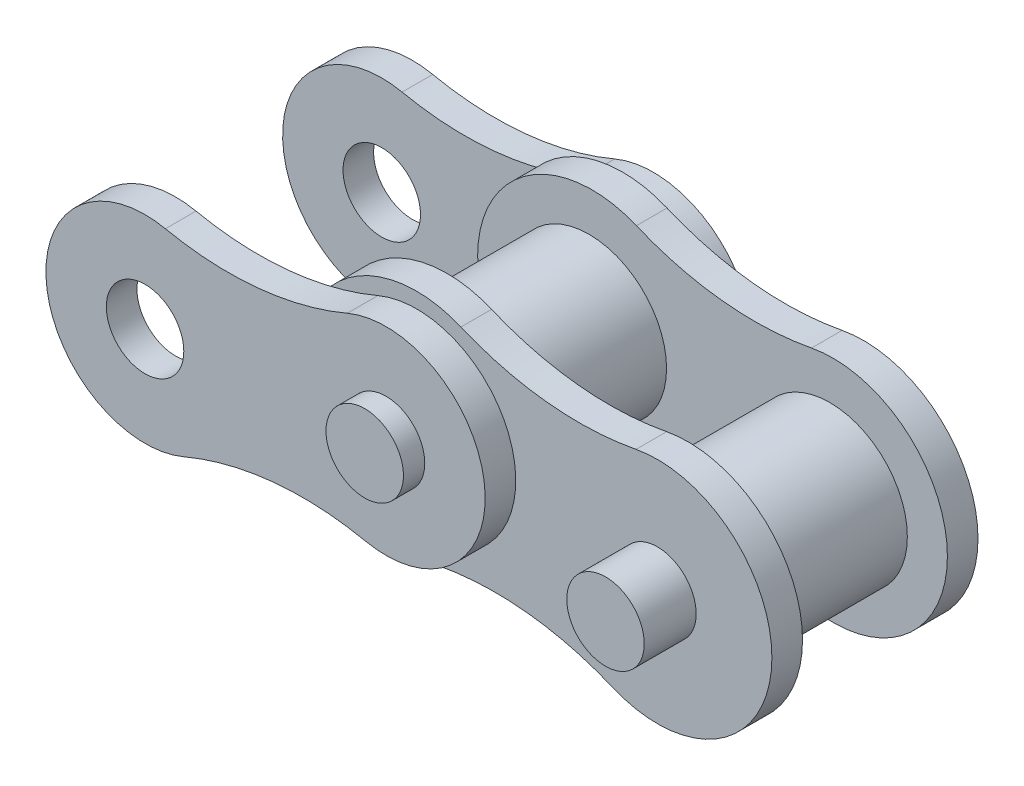
ISO-10303-21;
HEADER;
FILE_DESCRIPTION(('STEP AP214'),'2;1');
FILE_NAME('part.step','',(''),(''),'','','');
FILE_SCHEMA(('AUTOMOTIVE_DESIGN { 1 0 10303 214 1 1 1 1 }'));
ENDSEC;
DATA;
#1=APPLICATION_CONTEXT('core data for automotive mechanical design processes');
#2=APPLICATION_PROTOCOL_DEFINITION('international standard','automotive_design',2000,#1);
#3=PRODUCT_CONTEXT('',#1,'mechanical');
#4=PRODUCT('Part','Part','',(#3));
#5=PRODUCT_RELATED_PRODUCT_CATEGORY('part','',(#4));
#6=PRODUCT_DEFINITION_FORMATION('','',#4);
#7=PRODUCT_DEFINITION_CONTEXT('part definition',#1,'design');
#8=PRODUCT_DEFINITION('design','',#6,#7);
#9=PRODUCT_DEFINITION_SHAPE('','',#8);
#10=(LENGTH_UNIT() NAMED_UNIT(*) SI_UNIT(.MILLI.,.METRE.));
#11=(NAMED_UNIT(*) PLANE_ANGLE_UNIT() SI_UNIT($,.RADIAN.));
#12=(NAMED_UNIT(*) SI_UNIT($,.STERADIAN.) SOLID_ANGLE_UNIT());
#13=UNCERTAINTY_MEASURE_WITH_UNIT(LENGTH_MEASURE(1.E-05),#10,'distance_accuracy_value','');
#14=(GEOMETRIC_REPRESENTATION_CONTEXT(3) GLOBAL_UNCERTAINTY_ASSIGNED_CONTEXT((#13)) GLOBAL_UNIT_ASSIGNED_CONTEXT((#10,
#11,#12)) REPRESENTATION_CONTEXT('',''));
#15=CARTESIAN_POINT('',(0.,0.,0.));
#16=DIRECTION('',(0.,0.,1.));
#17=DIRECTION('',(1.,0.,0.));
#18=AXIS2_PLACEMENT_3D('',#15,#16,#17);
#19=CARTESIAN_POINT('',(15.7880356525904,74.277116008112,19.1184097937106));
#20=DIRECTION('',(0.,0.,-1.));
#21=DIRECTION('',(-1.,0.,0.));
#22=AXIS2_PLACEMENT_3D('',#19,#20,#21);
#23=CYLINDRICAL_SURFACE('',#22,5.08);
#24=CARTESIAN_POINT('',(15.7880356525904,74.277116008112,4.55));
#25=DIRECTION('',(0.,0.,-1.));
#26=DIRECTION('',(-1.,0.,0.));
#27=AXIS2_PLACEMENT_3D('',#24,#25,#26);
#28=CIRCLE('',#27,5.08);
#29=CARTESIAN_POINT('',(10.7080356525904,74.277116008112,4.55));
#30=VERTEX_POINT('',#29);
#31=EDGE_CURVE('E12',#30,#30,#28,.T.);
#32=ORIENTED_EDGE('',*,*,#31,.T.);
#33=EDGE_LOOP('',(#32));
#34=FACE_BOUND('',#33,.T.);
#35=CARTESIAN_POINT('',(15.7880356525904,74.277116008112,-4.55));
#36=DIRECTION('',(0.,0.,1.));
#37=DIRECTION('',(1.,0.,0.));
#38=AXIS2_PLACEMENT_3D('',#35,#36,#37);
#39=CIRCLE('',#38,5.08);
#40=CARTESIAN_POINT('',(20.8680356525904,74.277116008112,-4.55));
#41=VERTEX_POINT('',#40);
#42=EDGE_CURVE('E48',#41,#41,#39,.F.);
#43=ORIENTED_EDGE('',*,*,#42,.F.);
#44=EDGE_LOOP('',(#43));
#45=FACE_BOUND('',#44,.T.);
#46=ADVANCED_FACE('F42',(#34,#45),#23,.T.);
#47=CARTESIAN_POINT('',(5.32341019510183,88.6172802211531,4.55));
#48=DIRECTION('',(0.,0.,-1.));
#49=DIRECTION('',(-1.,0.,0.));
#50=AXIS2_PLACEMENT_3D('',#47,#48,#49);
#51=PLANE('',#50);
#52=ORIENTED_EDGE('',*,*,#31,.F.);
#53=EDGE_LOOP('',(#52));
#54=FACE_BOUND('',#53,.T.);
#55=ADVANCED_FACE('F57',(#54),#51,.F.);
#56=CARTESIAN_POINT('',(5.32341019510183,88.6172802211531,-4.55));
#57=DIRECTION('',(0.,0.,1.));
#58=DIRECTION('',(-1.,0.,0.));
#59=AXIS2_PLACEMENT_3D('',#56,#57,#58);
#60=PLANE('',#59);
#61=ORIENTED_EDGE('',*,*,#42,.T.);
#62=EDGE_LOOP('',(#61));
#63=FACE_BOUND('',#62,.T.);
#64=ADVANCED_FACE('F54',(#63),#60,.F.);
#65=CLOSED_SHELL('',(#46,#55,#64));
#66=MANIFOLD_SOLID_BREP('B2',#65);
#67=CARTESIAN_POINT('',(0.,75.9365,19.1184097937106));
#68=DIRECTION('',(0.,0.,-1.));
#69=DIRECTION('',(-1.,0.,0.));
#70=AXIS2_PLACEMENT_3D('',#67,#68,#69);
#71=CYLINDRICAL_SURFACE('',#70,5.08);
#72=CARTESIAN_POINT('',(0.,75.9365,4.55));
#73=DIRECTION('',(0.,0.,-1.));
#74=DIRECTION('',(-1.,0.,0.));
#75=AXIS2_PLACEMENT_3D('',#72,#73,#74);
#76=CIRCLE('',#75,5.08);
#77=CARTESIAN_POINT('',(-5.08,75.9365,4.55));
#78=VERTEX_POINT('',#77);
#79=EDGE_CURVE('E41',#78,#78,#76,.T.);
#80=ORIENTED_EDGE('',*,*,#79,.T.);
#81=EDGE_LOOP('',(#80));
#82=FACE_BOUND('',#81,.T.);
#83=CARTESIAN_POINT('',(0.,75.9365,-4.55));
#84=DIRECTION('',(0.,0.,1.));
#85=DIRECTION('',(1.,0.,0.));
#86=AXIS2_PLACEMENT_3D('',#83,#84,#85);
#87=CIRCLE('',#86,5.08);
#88=CARTESIAN_POINT('',(5.08,75.9365,-4.55));
#89=VERTEX_POINT('',#88);
#90=EDGE_CURVE('E97',#89,#89,#87,.F.);
#91=ORIENTED_EDGE('',*,*,#90,.F.);
#92=EDGE_LOOP('',(#91));
#93=FACE_BOUND('',#92,.T.);
#94=ADVANCED_FACE('F91',(#82,#93),#71,.T.);
#95=CARTESIAN_POINT('',(5.32341019510183,88.6172802211531,4.55));
#96=DIRECTION('',(0.,0.,-1.));
#97=DIRECTION('',(-1.,0.,0.));
#98=AXIS2_PLACEMENT_3D('',#95,#96,#97);
#99=PLANE('',#98);
#100=ORIENTED_EDGE('',*,*,#79,.F.);
#101=EDGE_LOOP('',(#100));
#102=FACE_BOUND('',#101,.T.);
#103=ADVANCED_FACE('F106',(#102),#99,.F.);
#104=CARTESIAN_POINT('',(5.32341019510183,88.6172802211531,-4.55));
#105=DIRECTION('',(0.,0.,1.));
#106=DIRECTION('',(-1.,0.,0.));
#107=AXIS2_PLACEMENT_3D('',#104,#105,#106);
#108=PLANE('',#107);
#109=ORIENTED_EDGE('',*,*,#90,.T.);
#110=EDGE_LOOP('',(#109));
#111=FACE_BOUND('',#110,.T.);
#112=ADVANCED_FACE('F103',(#111),#108,.F.);
#113=CLOSED_SHELL('',(#94,#103,#112));
#114=MANIFOLD_SOLID_BREP('B7',#113);
#115=CARTESIAN_POINT('',(15.7880356525904,74.277116008112,10.16));
#116=DIRECTION('',(0.,0.,-1.));
#117=DIRECTION('',(-1.,0.,0.));
#118=AXIS2_PLACEMENT_3D('',#115,#116,#117);
#119=CYLINDRICAL_SURFACE('',#118,2.54);
#120=CARTESIAN_POINT('',(15.7880356525904,74.277116008112,10.16));
#121=DIRECTION('',(0.,0.,-1.));
#122=DIRECTION('',(-1.,0.,0.));
#123=AXIS2_PLACEMENT_3D('',#120,#121,#122);
#124=CIRCLE('',#123,2.54);
#125=CARTESIAN_POINT('',(13.2480356525904,74.277116008112,10.16));
#126=VERTEX_POINT('',#125);
#127=EDGE_CURVE('E90',#126,#126,#124,.T.);
#128=ORIENTED_EDGE('',*,*,#127,.T.);
#129=EDGE_LOOP('',(#128));
#130=FACE_BOUND('',#129,.T.);
#131=CARTESIAN_POINT('',(15.7880356525904,74.277116008112,-10.16));
#132=DIRECTION('',(0.,0.,-1.));
#133=DIRECTION('',(-1.,0.,0.));
#134=AXIS2_PLACEMENT_3D('',#131,#132,#133);
#135=CIRCLE('',#134,2.54);
#136=CARTESIAN_POINT('',(13.2480356525904,74.277116008112,-10.16));
#137=VERTEX_POINT('',#136);
#138=EDGE_CURVE('E146',#137,#137,#135,.T.);
#139=ORIENTED_EDGE('',*,*,#138,.F.);
#140=EDGE_LOOP('',(#139));
#141=FACE_BOUND('',#140,.T.);
#142=ADVANCED_FACE('F140',(#130,#141),#119,.T.);
#143=CARTESIAN_POINT('',(15.7880356525904,74.277116008112,10.16));
#144=DIRECTION('',(0.,0.,-1.));
#145=DIRECTION('',(-1.,0.,0.));
#146=AXIS2_PLACEMENT_3D('',#143,#144,#145);
#147=PLANE('',#146);
#148=ORIENTED_EDGE('',*,*,#127,.F.);
#149=EDGE_LOOP('',(#148));
#150=FACE_BOUND('',#149,.T.);
#151=ADVANCED_FACE('F155',(#150),#147,.F.);
#152=CARTESIAN_POINT('',(15.7880356525904,74.277116008112,-10.16));
#153=DIRECTION('',(0.,0.,-1.));
#154=DIRECTION('',(-1.,0.,0.));
#155=AXIS2_PLACEMENT_3D('',#152,#153,#154);
#156=PLANE('',#155);
#157=ORIENTED_EDGE('',*,*,#138,.T.);
#158=EDGE_LOOP('',(#157));
#159=FACE_BOUND('',#158,.T.);
#160=ADVANCED_FACE('F152',(#159),#156,.T.);
#161=CLOSED_SHELL('',(#142,#151,#160));
#162=MANIFOLD_SOLID_BREP('B36',#161);
#163=CARTESIAN_POINT('',(0.,75.9365,10.16));
#164=DIRECTION('',(0.,0.,-1.));
#165=DIRECTION('',(-1.,0.,0.));
#166=AXIS2_PLACEMENT_3D('',#163,#164,#165);
#167=CYLINDRICAL_SURFACE('',#166,2.54);
#168=CARTESIAN_POINT('',(0.,75.9365,10.16));
#169=DIRECTION('',(0.,0.,-1.));
#170=DIRECTION('',(-1.,0.,0.));
#171=AXIS2_PLACEMENT_3D('',#168,#169,#170);
#172=CIRCLE('',#171,2.54);
#173=CARTESIAN_POINT('',(-2.54,75.9365,10.16));
#174=VERTEX_POINT('',#173);
#175=EDGE_CURVE('E139',#174,#174,#172,.T.);
#176=ORIENTED_EDGE('',*,*,#175,.T.);
#177=EDGE_LOOP('',(#176));
#178=FACE_BOUND('',#177,.T.);
#179=CARTESIAN_POINT('',(0.,75.9365,-10.16));
#180=DIRECTION('',(0.,0.,-1.));
#181=DIRECTION('',(-1.,0.,0.));
#182=AXIS2_PLACEMENT_3D('',#179,#180,#181);
#183=CIRCLE('',#182,2.54);
#184=CARTESIAN_POINT('',(-2.54,75.9365,-10.16));
#185=VERTEX_POINT('',#184);
#186=EDGE_CURVE('E197',#185,#185,#183,.T.);
#187=ORIENTED_EDGE('',*,*,#186,.F.);
#188=EDGE_LOOP('',(#187));
#189=FACE_BOUND('',#188,.T.);
#190=ADVANCED_FACE('F191',(#178,#189),#167,.T.);
#191=CARTESIAN_POINT('',(0.,75.9365,10.16));
#192=DIRECTION('',(0.,0.,-1.));
#193=DIRECTION('',(-1.,0.,0.));
#194=AXIS2_PLACEMENT_3D('',#191,#192,#193);
#195=PLANE('',#194);
#196=ORIENTED_EDGE('',*,*,#175,.F.);
#197=EDGE_LOOP('',(#196));
#198=FACE_BOUND('',#197,.T.);
#199=ADVANCED_FACE('F206',(#198),#195,.F.);
#200=CARTESIAN_POINT('',(0.,75.9365,-10.16));
#201=DIRECTION('',(0.,0.,-1.));
#202=DIRECTION('',(-1.,0.,0.));
#203=AXIS2_PLACEMENT_3D('',#200,#201,#202);
#204=PLANE('',#203);
#205=ORIENTED_EDGE('',*,*,#186,.T.);
#206=EDGE_LOOP('',(#205));
#207=FACE_BOUND('',#206,.T.);
#208=ADVANCED_FACE('F203',(#207),#204,.T.);
#209=CLOSED_SHELL('',(#190,#199,#208));
#210=MANIFOLD_SOLID_BREP('B85',#209);
#211=CARTESIAN_POINT('',(-13.0788342811586,87.3607901900289,-8.7632));
#212=DIRECTION('',(0.,0.,1.));
#213=DIRECTION('',(-1.,0.,0.));
#214=AXIS2_PLACEMENT_3D('',#211,#212,#213);
#215=PLANE('',#214);
#216=CARTESIAN_POINT('',(0.,75.9365,-8.7632));
#217=DIRECTION('',(0.,0.,1.));
#218=DIRECTION('',(1.,0.,0.));
#219=AXIS2_PLACEMENT_3D('',#216,#217,#218);
#220=CIRCLE('',#219,2.54);
#221=CARTESIAN_POINT('',(2.54,75.9365,-8.7632));
#222=VERTEX_POINT('',#221);
#223=EDGE_CURVE('E311',#222,#222,#220,.T.);
#224=ORIENTED_EDGE('',*,*,#223,.T.);
#225=EDGE_LOOP('',(#224));
#226=FACE_BOUND('',#225,.T.);
#227=CARTESIAN_POINT('',(-10.357864798803,100.328396949801,-8.7632));
#228=DIRECTION('',(0.,0.,-1.));
#229=DIRECTION('',(-1.,0.,0.));
#230=AXIS2_PLACEMENT_3D('',#227,#228,#229);
#231=CIRCLE('',#230,20.);
#232=CARTESIAN_POINT('',(-2.54060834687622,81.9194181197626,-8.7632));
#233=VERTEX_POINT('',#232);
#234=CARTESIAN_POINT('',(-14.4649885457548,80.7546508973148,-8.7632));
#235=VERTEX_POINT('',#234);
#236=EDGE_CURVE('E299',#233,#235,#231,.T.);
#237=ORIENTED_EDGE('',*,*,#236,.F.);
#238=CARTESIAN_POINT('',(0.,75.9365,-8.7632));
#239=DIRECTION('',(0.,0.,1.));
#240=DIRECTION('',(1.,0.,0.));
#241=AXIS2_PLACEMENT_3D('',#238,#239,#240);
#242=CIRCLE('',#241,6.5);
#243=CARTESIAN_POINT('',(-1.33481521775932,69.575032532942,-8.7632));
#244=VERTEX_POINT('',#243);
#245=EDGE_CURVE('E302',#244,#233,#242,.T.);
#246=ORIENTED_EDGE('',*,*,#245,.F.);
#247=CARTESIAN_POINT('',(-5.4419389647111,50.0012864804556,-8.7632));
#248=DIRECTION('',(0.,0.,-1.));
#249=DIRECTION('',(-1.,0.,0.));
#250=AXIS2_PLACEMENT_3D('',#247,#248,#249);
#251=CIRCLE('',#250,20.);
#252=CARTESIAN_POINT('',(-13.2591954166379,68.4102653104942,-8.7632));
#253=VERTEX_POINT('',#252);
#254=EDGE_CURVE('E290',#253,#244,#251,.T.);
#255=ORIENTED_EDGE('',*,*,#254,.F.);
#256=CARTESIAN_POINT('',(-15.7998037635141,74.3931834302567,-8.7632));
#257=DIRECTION('',(0.,0.,1.));
#258=DIRECTION('',(1.,0.,0.));
#259=AXIS2_PLACEMENT_3D('',#256,#257,#258);
#260=CIRCLE('',#259,6.5);
#261=EDGE_CURVE('E295',#235,#253,#260,.T.);
#262=ORIENTED_EDGE('',*,*,#261,.F.);
#263=EDGE_LOOP('',(#237,#246,#255,#262));
#264=FACE_BOUND('',#263,.T.);
#265=CARTESIAN_POINT('',(-15.7998037635141,74.3931834302567,-8.7632));
#266=DIRECTION('',(0.,0.,1.));
#267=DIRECTION('',(1.,0.,0.));
#268=AXIS2_PLACEMENT_3D('',#265,#266,#267);
#269=CIRCLE('',#268,2.53999999999999);
#270=CARTESIAN_POINT('',(-13.2598037635142,74.3931834302567,-8.7632));
#271=VERTEX_POINT('',#270);
#272=EDGE_CURVE('E322',#271,#271,#269,.T.);
#273=ORIENTED_EDGE('',*,*,#272,.T.);
#274=EDGE_LOOP('',(#273));
#275=FACE_BOUND('',#274,.T.);
#276=ADVANCED_FACE('F243',(#226,#264,#275),#215,.F.);
#277=CARTESIAN_POINT('',(-13.0788342811586,87.3607901900289,-6.7566));
#278=DIRECTION('',(0.,0.,1.));
#279=DIRECTION('',(-1.,0.,0.));
#280=AXIS2_PLACEMENT_3D('',#277,#278,#279);
#281=PLANE('',#280);
#282=CARTESIAN_POINT('',(0.,75.9365,-6.7566));
#283=DIRECTION('',(0.,0.,1.));
#284=DIRECTION('',(1.,0.,0.));
#285=AXIS2_PLACEMENT_3D('',#282,#283,#284);
#286=CIRCLE('',#285,2.54);
#287=CARTESIAN_POINT('',(2.54,75.9365,-6.7566));
#288=VERTEX_POINT('',#287);
#289=EDGE_CURVE('E319',#288,#288,#286,.T.);
#290=ORIENTED_EDGE('',*,*,#289,.F.);
#291=EDGE_LOOP('',(#290));
#292=FACE_BOUND('',#291,.T.);
#293=CARTESIAN_POINT('',(-10.357864798803,100.328396949801,-6.7566));
#294=DIRECTION('',(0.,0.,-1.));
#295=DIRECTION('',(-1.,0.,0.));
#296=AXIS2_PLACEMENT_3D('',#293,#294,#295);
#297=CIRCLE('',#296,20.);
#298=CARTESIAN_POINT('',(-2.54060834687622,81.9194181197626,-6.7566));
#299=VERTEX_POINT('',#298);
#300=CARTESIAN_POINT('',(-14.4649885457548,80.7546508973148,-6.7566));
#301=VERTEX_POINT('',#300);
#302=EDGE_CURVE('E307',#299,#301,#297,.T.);
#303=ORIENTED_EDGE('',*,*,#302,.T.);
#304=CARTESIAN_POINT('',(-15.7998037635141,74.3931834302567,-6.7566));
#305=DIRECTION('',(0.,0.,1.));
#306=DIRECTION('',(1.,0.,0.));
#307=AXIS2_PLACEMENT_3D('',#304,#305,#306);
#308=CIRCLE('',#307,6.5);
#309=CARTESIAN_POINT('',(-13.2591954166379,68.4102653104942,-6.7566));
#310=VERTEX_POINT('',#309);
#311=EDGE_CURVE('E310',#301,#310,#308,.T.);
#312=ORIENTED_EDGE('',*,*,#311,.T.);
#313=CARTESIAN_POINT('',(-5.4419389647111,50.0012864804556,-6.7566));
#314=DIRECTION('',(0.,0.,-1.));
#315=DIRECTION('',(-1.,0.,0.));
#316=AXIS2_PLACEMENT_3D('',#313,#314,#315);
#317=CIRCLE('',#316,20.);
#318=CARTESIAN_POINT('',(-1.33481521775932,69.575032532942,-6.7566));
#319=VERTEX_POINT('',#318);
#320=EDGE_CURVE('E293',#310,#319,#317,.T.);
#321=ORIENTED_EDGE('',*,*,#320,.T.);
#322=CARTESIAN_POINT('',(0.,75.9365,-6.7566));
#323=DIRECTION('',(0.,0.,1.));
#324=DIRECTION('',(1.,0.,0.));
#325=AXIS2_PLACEMENT_3D('',#322,#323,#324);
#326=CIRCLE('',#325,6.5);
#327=EDGE_CURVE('E314',#319,#299,#326,.T.);
#328=ORIENTED_EDGE('',*,*,#327,.T.);
#329=EDGE_LOOP('',(#303,#312,#321,#328));
#330=FACE_BOUND('',#329,.T.);
#331=CARTESIAN_POINT('',(-15.7998037635141,74.3931834302567,-6.7566));
#332=DIRECTION('',(0.,0.,1.));
#333=DIRECTION('',(1.,0.,0.));
#334=AXIS2_PLACEMENT_3D('',#331,#332,#333);
#335=CIRCLE('',#334,2.53999999999999);
#336=CARTESIAN_POINT('',(-13.2598037635142,74.3931834302567,-6.7566));
#337=VERTEX_POINT('',#336);
#338=EDGE_CURVE('E325',#337,#337,#335,.T.);
#339=ORIENTED_EDGE('',*,*,#338,.F.);
#340=EDGE_LOOP('',(#339));
#341=FACE_BOUND('',#340,.T.);
#342=ADVANCED_FACE('F338',(#292,#330,#341),#281,.T.);
#343=CARTESIAN_POINT('',(-10.357864798803,100.328396949801,-8.7632));
#344=DIRECTION('',(0.,0.,1.));
#345=DIRECTION('',(-1.,0.,0.));
#346=AXIS2_PLACEMENT_3D('',#343,#344,#345);
#347=CYLINDRICAL_SURFACE('',#346,20.);
#348=ORIENTED_EDGE('',*,*,#302,.F.);
#349=DIRECTION('',(0.,0.,1.));
#350=VECTOR('',#349,1.);
#351=CARTESIAN_POINT('',(-2.54060834687622,81.9194181197626,-8.7632));
#352=LINE('',#351,#350);
#353=EDGE_CURVE('E260',#233,#299,#352,.T.);
#354=ORIENTED_EDGE('',*,*,#353,.F.);
#355=ORIENTED_EDGE('',*,*,#236,.T.);
#356=DIRECTION('',(0.,0.,1.));
#357=VECTOR('',#356,1.);
#358=CARTESIAN_POINT('',(-14.4649885457548,80.7546508973148,-8.7632));
#359=LINE('',#358,#357);
#360=EDGE_CURVE('E189',#235,#301,#359,.T.);
#361=ORIENTED_EDGE('',*,*,#360,.T.);
#362=EDGE_LOOP('',(#348,#354,#355,#361));
#363=FACE_BOUND('',#362,.T.);
#364=ADVANCED_FACE('F245',(#363),#347,.F.);
#365=CARTESIAN_POINT('',(-15.7998037635141,74.3931834302567,-8.7632));
#366=DIRECTION('',(0.,0.,1.));
#367=DIRECTION('',(-1.,0.,0.));
#368=AXIS2_PLACEMENT_3D('',#365,#366,#367);
#369=CYLINDRICAL_SURFACE('',#368,6.5);
#370=ORIENTED_EDGE('',*,*,#311,.F.);
#371=ORIENTED_EDGE('',*,*,#360,.F.);
#372=ORIENTED_EDGE('',*,*,#261,.T.);
#373=DIRECTION('',(0.,0.,1.));
#374=VECTOR('',#373,1.);
#375=CARTESIAN_POINT('',(-13.2591954166379,68.4102653104942,-8.7632));
#376=LINE('',#375,#374);
#377=EDGE_CURVE('E252',#253,#310,#376,.T.);
#378=ORIENTED_EDGE('',*,*,#377,.T.);
#379=EDGE_LOOP('',(#370,#371,#372,#378));
#380=FACE_BOUND('',#379,.T.);
#381=ADVANCED_FACE('F296',(#380),#369,.T.);
#382=CARTESIAN_POINT('',(-5.4419389647111,50.0012864804556,-8.7632));
#383=DIRECTION('',(0.,0.,1.));
#384=DIRECTION('',(-1.,0.,0.));
#385=AXIS2_PLACEMENT_3D('',#382,#383,#384);
#386=CYLINDRICAL_SURFACE('',#385,20.);
#387=ORIENTED_EDGE('',*,*,#320,.F.);
#388=ORIENTED_EDGE('',*,*,#377,.F.);
#389=ORIENTED_EDGE('',*,*,#254,.T.);
#390=DIRECTION('',(0.,0.,1.));
#391=VECTOR('',#390,1.);
#392=CARTESIAN_POINT('',(-1.33481521775932,69.575032532942,-8.7632));
#393=LINE('',#392,#391);
#394=EDGE_CURVE('E276',#244,#319,#393,.T.);
#395=ORIENTED_EDGE('',*,*,#394,.T.);
#396=EDGE_LOOP('',(#387,#388,#389,#395));
#397=FACE_BOUND('',#396,.T.);
#398=ADVANCED_FACE('F288',(#397),#386,.F.);
#399=CARTESIAN_POINT('',(0.,75.9365,-8.7632));
#400=DIRECTION('',(0.,0.,1.));
#401=DIRECTION('',(-1.,0.,0.));
#402=AXIS2_PLACEMENT_3D('',#399,#400,#401);
#403=CYLINDRICAL_SURFACE('',#402,6.5);
#404=ORIENTED_EDGE('',*,*,#327,.F.);
#405=ORIENTED_EDGE('',*,*,#394,.F.);
#406=ORIENTED_EDGE('',*,*,#245,.T.);
#407=ORIENTED_EDGE('',*,*,#353,.T.);
#408=EDGE_LOOP('',(#404,#405,#406,#407));
#409=FACE_BOUND('',#408,.T.);
#410=ADVANCED_FACE('F351',(#409),#403,.T.);
#411=CARTESIAN_POINT('',(0.,75.9365,-8.7632));
#412=DIRECTION('',(0.,0.,1.));
#413=DIRECTION('',(-1.,0.,0.));
#414=AXIS2_PLACEMENT_3D('',#411,#412,#413);
#415=CYLINDRICAL_SURFACE('',#414,2.54);
#416=ORIENTED_EDGE('',*,*,#223,.F.);
#417=EDGE_LOOP('',(#416));
#418=FACE_BOUND('',#417,.T.);
#419=ORIENTED_EDGE('',*,*,#289,.T.);
#420=EDGE_LOOP('',(#419));
#421=FACE_BOUND('',#420,.T.);
#422=ADVANCED_FACE('F334',(#418,#421),#415,.F.);
#423=CARTESIAN_POINT('',(-15.7998037635141,74.3931834302567,-8.7632));
#424=DIRECTION('',(0.,0.,1.));
#425=DIRECTION('',(-1.,0.,0.));
#426=AXIS2_PLACEMENT_3D('',#423,#424,#425);
#427=CYLINDRICAL_SURFACE('',#426,2.53999999999999);
#428=ORIENTED_EDGE('',*,*,#272,.F.);
#429=EDGE_LOOP('',(#428));
#430=FACE_BOUND('',#429,.T.);
#431=ORIENTED_EDGE('',*,*,#338,.T.);
#432=EDGE_LOOP('',(#431));
#433=FACE_BOUND('',#432,.T.);
#434=ADVANCED_FACE('F331',(#430,#433),#427,.F.);
#435=CLOSED_SHELL('',(#276,#342,#364,#381,#398,#410,#422,#434));
#436=MANIFOLD_SOLID_BREP('B134',#435);
#437=CARTESIAN_POINT('',(5.32341019510183,88.6172802211531,-6.7566));
#438=DIRECTION('',(0.,0.,1.));
#439=DIRECTION('',(-1.,0.,0.));
#440=AXIS2_PLACEMENT_3D('',#437,#438,#439);
#441=PLANE('',#440);
#442=CARTESIAN_POINT('',(0.,75.9365,-6.7566));
#443=DIRECTION('',(0.,0.,1.));
#444=DIRECTION('',(1.,0.,0.));
#445=AXIS2_PLACEMENT_3D('',#442,#443,#444);
#446=CIRCLE('',#445,2.53999999999999);
#447=CARTESIAN_POINT('',(2.53999999999999,75.9365,-6.7566));
#448=VERTEX_POINT('',#447);
#449=EDGE_CURVE('E488',#448,#448,#446,.T.);
#450=ORIENTED_EDGE('',*,*,#449,.T.);
#451=EDGE_LOOP('',(#450));
#452=FACE_BOUND('',#451,.T.);
#453=CARTESIAN_POINT('',(10.6468203902037,101.298060442306,-6.7566));
#454=DIRECTION('',(0.,0.,-1.));
#455=DIRECTION('',(-1.,0.,0.));
#456=AXIS2_PLACEMENT_3D('',#453,#454,#455);
#457=CIRCLE('',#456,20.);
#458=CARTESIAN_POINT('',(14.3851111898465,81.6505368859566,-6.7566));
#459=VERTEX_POINT('',#458);
#460=CARTESIAN_POINT('',(2.90528289782669,82.8571115173152,-6.7566));
#461=VERTEX_POINT('',#460);
#462=EDGE_CURVE('E476',#459,#461,#457,.T.);
#463=ORIENTED_EDGE('',*,*,#462,.F.);
#464=CARTESIAN_POINT('',(15.7880356525904,74.277116008112,-6.7566));
#465=DIRECTION('',(0.,0.,1.));
#466=DIRECTION('',(1.,0.,0.));
#467=AXIS2_PLACEMENT_3D('',#464,#465,#466);
#468=CIRCLE('',#467,7.50569999999999);
#469=CARTESIAN_POINT('',(12.8827527547637,67.3565044907969,-6.7566));
#470=VERTEX_POINT('',#469);
#471=EDGE_CURVE('E479',#470,#459,#468,.T.);
#472=ORIENTED_EDGE('',*,*,#471,.F.);
#473=CARTESIAN_POINT('',(5.14121526238675,48.915555565806,-6.7566));
#474=DIRECTION('',(0.,0.,-1.));
#475=DIRECTION('',(1.,0.,0.));
#476=AXIS2_PLACEMENT_3D('',#473,#474,#475);
#477=CIRCLE('',#476,20.);
#478=CARTESIAN_POINT('',(1.40292446274395,68.5630791221554,-6.7566));
#479=VERTEX_POINT('',#478);
#480=EDGE_CURVE('E467',#479,#470,#477,.T.);
#481=ORIENTED_EDGE('',*,*,#480,.F.);
#482=CARTESIAN_POINT('',(0.,75.9365,-6.7566));
#483=DIRECTION('',(0.,0.,1.));
#484=DIRECTION('',(1.,0.,0.));
#485=AXIS2_PLACEMENT_3D('',#482,#483,#484);
#486=CIRCLE('',#485,7.50569999999999);
#487=EDGE_CURVE('E472',#461,#479,#486,.T.);
#488=ORIENTED_EDGE('',*,*,#487,.F.);
#489=EDGE_LOOP('',(#463,#472,#481,#488));
#490=FACE_BOUND('',#489,.T.);
#491=CARTESIAN_POINT('',(15.7880356525904,74.277116008112,-6.7566));
#492=DIRECTION('',(0.,0.,1.));
#493=DIRECTION('',(1.,0.,0.));
#494=AXIS2_PLACEMENT_3D('',#491,#492,#493);
#495=CIRCLE('',#494,2.53999999999999);
#496=CARTESIAN_POINT('',(18.3280356525904,74.277116008112,-6.7566));
#497=VERTEX_POINT('',#496);
#498=EDGE_CURVE('E499',#497,#497,#495,.T.);
#499=ORIENTED_EDGE('',*,*,#498,.T.);
#500=EDGE_LOOP('',(#499));
#501=FACE_BOUND('',#500,.T.);
#502=ADVANCED_FACE('F420',(#452,#490,#501),#441,.F.);
#503=CARTESIAN_POINT('',(5.32341019510183,88.6172802211531,-4.75));
#504=DIRECTION('',(0.,0.,1.));
#505=DIRECTION('',(-1.,0.,0.));
#506=AXIS2_PLACEMENT_3D('',#503,#504,#505);
#507=PLANE('',#506);
#508=CARTESIAN_POINT('',(0.,75.9365,-4.75));
#509=DIRECTION('',(0.,0.,1.));
#510=DIRECTION('',(1.,0.,0.));
#511=AXIS2_PLACEMENT_3D('',#508,#509,#510);
#512=CIRCLE('',#511,2.53999999999999);
#513=CARTESIAN_POINT('',(2.53999999999999,75.9365,-4.75));
#514=VERTEX_POINT('',#513);
#515=EDGE_CURVE('E496',#514,#514,#512,.T.);
#516=ORIENTED_EDGE('',*,*,#515,.F.);
#517=EDGE_LOOP('',(#516));
#518=FACE_BOUND('',#517,.T.);
#519=CARTESIAN_POINT('',(10.6468203902037,101.298060442306,-4.75));
#520=DIRECTION('',(0.,0.,-1.));
#521=DIRECTION('',(-1.,0.,0.));
#522=AXIS2_PLACEMENT_3D('',#519,#520,#521);
#523=CIRCLE('',#522,20.);
#524=CARTESIAN_POINT('',(14.3851111898465,81.6505368859566,-4.75));
#525=VERTEX_POINT('',#524);
#526=CARTESIAN_POINT('',(2.90528289782669,82.8571115173152,-4.75));
#527=VERTEX_POINT('',#526);
#528=EDGE_CURVE('E484',#525,#527,#523,.T.);
#529=ORIENTED_EDGE('',*,*,#528,.T.);
#530=CARTESIAN_POINT('',(0.,75.9365,-4.75));
#531=DIRECTION('',(0.,0.,1.));
#532=DIRECTION('',(1.,0.,0.));
#533=AXIS2_PLACEMENT_3D('',#530,#531,#532);
#534=CIRCLE('',#533,7.50569999999999);
#535=CARTESIAN_POINT('',(1.40292446274395,68.5630791221554,-4.75));
#536=VERTEX_POINT('',#535);
#537=EDGE_CURVE('E487',#527,#536,#534,.T.);
#538=ORIENTED_EDGE('',*,*,#537,.T.);
#539=CARTESIAN_POINT('',(5.14121526238675,48.915555565806,-4.75));
#540=DIRECTION('',(0.,0.,-1.));
#541=DIRECTION('',(1.,0.,0.));
#542=AXIS2_PLACEMENT_3D('',#539,#540,#541);
#543=CIRCLE('',#542,20.);
#544=CARTESIAN_POINT('',(12.8827527547637,67.3565044907969,-4.75));
#545=VERTEX_POINT('',#544);
#546=EDGE_CURVE('E470',#536,#545,#543,.T.);
#547=ORIENTED_EDGE('',*,*,#546,.T.);
#548=CARTESIAN_POINT('',(15.7880356525904,74.277116008112,-4.75));
#549=DIRECTION('',(0.,0.,1.));
#550=DIRECTION('',(1.,0.,0.));
#551=AXIS2_PLACEMENT_3D('',#548,#549,#550);
#552=CIRCLE('',#551,7.50569999999999);
#553=EDGE_CURVE('E491',#545,#525,#552,.T.);
#554=ORIENTED_EDGE('',*,*,#553,.T.);
#555=EDGE_LOOP('',(#529,#538,#547,#554));
#556=FACE_BOUND('',#555,.T.);
#557=CARTESIAN_POINT('',(15.7880356525904,74.277116008112,-4.75));
#558=DIRECTION('',(0.,0.,1.));
#559=DIRECTION('',(1.,0.,0.));
#560=AXIS2_PLACEMENT_3D('',#557,#558,#559);
#561=CIRCLE('',#560,2.53999999999999);
#562=CARTESIAN_POINT('',(18.3280356525904,74.277116008112,-4.75));
#563=VERTEX_POINT('',#562);
#564=EDGE_CURVE('E502',#563,#563,#561,.T.);
#565=ORIENTED_EDGE('',*,*,#564,.F.);
#566=EDGE_LOOP('',(#565));
#567=FACE_BOUND('',#566,.T.);
#568=ADVANCED_FACE('F515',(#518,#556,#567),#507,.T.);
#569=CARTESIAN_POINT('',(10.6468203902037,101.298060442306,-6.7566));
#570=DIRECTION('',(0.,0.,1.));
#571=DIRECTION('',(-1.,0.,0.));
#572=AXIS2_PLACEMENT_3D('',#569,#570,#571);
#573=CYLINDRICAL_SURFACE('',#572,20.);
#574=ORIENTED_EDGE('',*,*,#528,.F.);
#575=DIRECTION('',(0.,0.,1.));
#576=VECTOR('',#575,1.);
#577=CARTESIAN_POINT('',(14.3851111898465,81.6505368859566,-6.7566));
#578=LINE('',#577,#576);
#579=EDGE_CURVE('E437',#459,#525,#578,.T.);
#580=ORIENTED_EDGE('',*,*,#579,.F.);
#581=ORIENTED_EDGE('',*,*,#462,.T.);
#582=DIRECTION('',(0.,0.,1.));
#583=VECTOR('',#582,1.);
#584=CARTESIAN_POINT('',(2.90528289782669,82.8571115173152,-6.7566));
#585=LINE('',#584,#583);
#586=EDGE_CURVE('E241',#461,#527,#585,.T.);
#587=ORIENTED_EDGE('',*,*,#586,.T.);
#588=EDGE_LOOP('',(#574,#580,#581,#587));
#589=FACE_BOUND('',#588,.T.);
#590=ADVANCED_FACE('F422',(#589),#573,.F.);
#591=CARTESIAN_POINT('',(0.,75.9365,-6.7566));
#592=DIRECTION('',(0.,0.,1.));
#593=DIRECTION('',(-1.,0.,0.));
#594=AXIS2_PLACEMENT_3D('',#591,#592,#593);
#595=CYLINDRICAL_SURFACE('',#594,7.50569999999999);
#596=ORIENTED_EDGE('',*,*,#537,.F.);
#597=ORIENTED_EDGE('',*,*,#586,.F.);
#598=ORIENTED_EDGE('',*,*,#487,.T.);
#599=DIRECTION('',(0.,0.,1.));
#600=VECTOR('',#599,1.);
#601=CARTESIAN_POINT('',(1.40292446274395,68.5630791221554,-6.7566));
#602=LINE('',#601,#600);
#603=EDGE_CURVE('E429',#479,#536,#602,.T.);
#604=ORIENTED_EDGE('',*,*,#603,.T.);
#605=EDGE_LOOP('',(#596,#597,#598,#604));
#606=FACE_BOUND('',#605,.T.);
#607=ADVANCED_FACE('F473',(#606),#595,.T.);
#608=CARTESIAN_POINT('',(5.14121526238675,48.915555565806,-6.7566));
#609=DIRECTION('',(0.,0.,1.));
#610=DIRECTION('',(-1.,0.,0.));
#611=AXIS2_PLACEMENT_3D('',#608,#609,#610);
#612=CYLINDRICAL_SURFACE('',#611,20.);
#613=ORIENTED_EDGE('',*,*,#546,.F.);
#614=ORIENTED_EDGE('',*,*,#603,.F.);
#615=ORIENTED_EDGE('',*,*,#480,.T.);
#616=DIRECTION('',(0.,0.,1.));
#617=VECTOR('',#616,1.);
#618=CARTESIAN_POINT('',(12.8827527547637,67.3565044907969,-6.7566));
#619=LINE('',#618,#617);
#620=EDGE_CURVE('E453',#470,#545,#619,.T.);
#621=ORIENTED_EDGE('',*,*,#620,.T.);
#622=EDGE_LOOP('',(#613,#614,#615,#621));
#623=FACE_BOUND('',#622,.T.);
#624=ADVANCED_FACE('F465',(#623),#612,.F.);
#625=CARTESIAN_POINT('',(15.7880356525904,74.277116008112,-6.7566));
#626=DIRECTION('',(0.,0.,1.));
#627=DIRECTION('',(-1.,0.,0.));
#628=AXIS2_PLACEMENT_3D('',#625,#626,#627);
#629=CYLINDRICAL_SURFACE('',#628,7.50569999999999);
#630=ORIENTED_EDGE('',*,*,#553,.F.);
#631=ORIENTED_EDGE('',*,*,#620,.F.);
#632=ORIENTED_EDGE('',*,*,#471,.T.);
#633=ORIENTED_EDGE('',*,*,#579,.T.);
#634=EDGE_LOOP('',(#630,#631,#632,#633));
#635=FACE_BOUND('',#634,.T.);
#636=ADVANCED_FACE('F528',(#635),#629,.T.);
#637=CARTESIAN_POINT('',(0.,75.9365,-6.7566));
#638=DIRECTION('',(0.,0.,1.));
#639=DIRECTION('',(-1.,0.,0.));
#640=AXIS2_PLACEMENT_3D('',#637,#638,#639);
#641=CYLINDRICAL_SURFACE('',#640,2.53999999999999);
#642=ORIENTED_EDGE('',*,*,#449,.F.);
#643=EDGE_LOOP('',(#642));
#644=FACE_BOUND('',#643,.T.);
#645=ORIENTED_EDGE('',*,*,#515,.T.);
#646=EDGE_LOOP('',(#645));
#647=FACE_BOUND('',#646,.T.);
#648=ADVANCED_FACE('F511',(#644,#647),#641,.F.);
#649=CARTESIAN_POINT('',(15.7880356525904,74.277116008112,-6.7566));
#650=DIRECTION('',(0.,0.,1.));
#651=DIRECTION('',(-1.,0.,0.));
#652=AXIS2_PLACEMENT_3D('',#649,#650,#651);
#653=CYLINDRICAL_SURFACE('',#652,2.53999999999999);
#654=ORIENTED_EDGE('',*,*,#498,.F.);
#655=EDGE_LOOP('',(#654));
#656=FACE_BOUND('',#655,.T.);
#657=ORIENTED_EDGE('',*,*,#564,.T.);
#658=EDGE_LOOP('',(#657));
#659=FACE_BOUND('',#658,.T.);
#660=ADVANCED_FACE('F508',(#656,#659),#653,.F.);
#661=CLOSED_SHELL('',(#502,#568,#590,#607,#624,#636,#648,#660));
#662=MANIFOLD_SOLID_BREP('B183',#661);
#663=CARTESIAN_POINT('',(-13.0788342811586,87.3607901900289,8.7632));
#664=DIRECTION('',(0.,0.,-1.));
#665=DIRECTION('',(-1.,0.,0.));
#666=AXIS2_PLACEMENT_3D('',#663,#664,#665);
#667=PLANE('',#666);
#668=CARTESIAN_POINT('',(0.,75.9365,8.7632));
#669=DIRECTION('',(0.,0.,1.));
#670=DIRECTION('',(1.,0.,0.));
#671=AXIS2_PLACEMENT_3D('',#668,#669,#670);
#672=CIRCLE('',#671,2.54);
#673=CARTESIAN_POINT('',(2.54,75.9365,8.7632));
#674=VERTEX_POINT('',#673);
#675=EDGE_CURVE('E663',#674,#674,#672,.T.);
#676=ORIENTED_EDGE('',*,*,#675,.F.);
#677=EDGE_LOOP('',(#676));
#678=FACE_BOUND('',#677,.T.);
#679=CARTESIAN_POINT('',(-10.357864798803,100.328396949801,8.7632));
#680=DIRECTION('',(0.,0.,-1.));
#681=DIRECTION('',(-1.,0.,0.));
#682=AXIS2_PLACEMENT_3D('',#679,#680,#681);
#683=CIRCLE('',#682,20.);
#684=CARTESIAN_POINT('',(-2.54060834687622,81.9194181197626,8.7632));
#685=VERTEX_POINT('',#684);
#686=CARTESIAN_POINT('',(-14.4649885457548,80.7546508973148,8.7632));
#687=VERTEX_POINT('',#686);
#688=EDGE_CURVE('E648',#685,#687,#683,.T.);
#689=ORIENTED_EDGE('',*,*,#688,.T.);
#690=CARTESIAN_POINT('',(-15.7998037635141,74.3931834302567,8.7632));
#691=DIRECTION('',(0.,0.,1.));
#692=DIRECTION('',(1.,0.,0.));
#693=AXIS2_PLACEMENT_3D('',#690,#691,#692);
#694=CIRCLE('',#693,6.5);
#695=CARTESIAN_POINT('',(-13.2591954166379,68.4102653104942,8.7632));
#696=VERTEX_POINT('',#695);
#697=EDGE_CURVE('E643',#687,#696,#694,.T.);
#698=ORIENTED_EDGE('',*,*,#697,.T.);
#699=CARTESIAN_POINT('',(-5.4419389647111,50.0012864804556,8.7632));
#700=DIRECTION('',(0.,0.,-1.));
#701=DIRECTION('',(-1.,0.,0.));
#702=AXIS2_PLACEMENT_3D('',#699,#700,#701);
#703=CIRCLE('',#702,20.);
#704=CARTESIAN_POINT('',(-1.33481521775932,69.575032532942,8.7632));
#705=VERTEX_POINT('',#704);
#706=EDGE_CURVE('E646',#696,#705,#703,.T.);
#707=ORIENTED_EDGE('',*,*,#706,.T.);
#708=CARTESIAN_POINT('',(0.,75.9365,8.7632));
#709=DIRECTION('',(0.,0.,1.));
#710=DIRECTION('',(1.,0.,0.));
#711=AXIS2_PLACEMENT_3D('',#708,#709,#710);
#712=CIRCLE('',#711,6.5);
#713=EDGE_CURVE('E613',#705,#685,#712,.T.);
#714=ORIENTED_EDGE('',*,*,#713,.T.);
#715=EDGE_LOOP('',(#689,#698,#707,#714));
#716=FACE_BOUND('',#715,.T.);
#717=CARTESIAN_POINT('',(-15.7998037635141,74.3931834302567,8.7632));
#718=DIRECTION('',(0.,0.,1.));
#719=DIRECTION('',(1.,0.,0.));
#720=AXIS2_PLACEMENT_3D('',#717,#718,#719);
#721=CIRCLE('',#720,2.53999999999999);
#722=CARTESIAN_POINT('',(-13.2598037635142,74.3931834302567,8.7632));
#723=VERTEX_POINT('',#722);
#724=EDGE_CURVE('E678',#723,#723,#721,.T.);
#725=ORIENTED_EDGE('',*,*,#724,.F.);
#726=EDGE_LOOP('',(#725));
#727=FACE_BOUND('',#726,.T.);
#728=ADVANCED_FACE('F596',(#678,#716,#727),#667,.F.);
#729=CARTESIAN_POINT('',(-13.0788342811586,87.3607901900289,6.7566));
#730=DIRECTION('',(0.,0.,-1.));
#731=DIRECTION('',(-1.,0.,0.));
#732=AXIS2_PLACEMENT_3D('',#729,#730,#731);
#733=PLANE('',#732);
#734=CARTESIAN_POINT('',(0.,75.9365,6.7566));
#735=DIRECTION('',(0.,0.,1.));
#736=DIRECTION('',(1.,0.,0.));
#737=AXIS2_PLACEMENT_3D('',#734,#735,#736);
#738=CIRCLE('',#737,2.54);
#739=CARTESIAN_POINT('',(2.54,75.9365,6.7566));
#740=VERTEX_POINT('',#739);
#741=EDGE_CURVE('E675',#740,#740,#738,.T.);
#742=ORIENTED_EDGE('',*,*,#741,.T.);
#743=EDGE_LOOP('',(#742));
#744=FACE_BOUND('',#743,.T.);
#745=CARTESIAN_POINT('',(-10.357864798803,100.328396949801,6.7566));
#746=DIRECTION('',(0.,0.,-1.));
#747=DIRECTION('',(-1.,0.,0.));
#748=AXIS2_PLACEMENT_3D('',#745,#746,#747);
#749=CIRCLE('',#748,20.);
#750=CARTESIAN_POINT('',(-2.54060834687622,81.9194181197626,6.7566));
#751=VERTEX_POINT('',#750);
#752=CARTESIAN_POINT('',(-14.4649885457548,80.7546508973148,6.7566));
#753=VERTEX_POINT('',#752);
#754=EDGE_CURVE('E660',#751,#753,#749,.T.);
#755=ORIENTED_EDGE('',*,*,#754,.F.);
#756=CARTESIAN_POINT('',(0.,75.9365,6.7566));
#757=DIRECTION('',(0.,0.,1.));
#758=DIRECTION('',(1.,0.,0.));
#759=AXIS2_PLACEMENT_3D('',#756,#757,#758);
#760=CIRCLE('',#759,6.5);
#761=CARTESIAN_POINT('',(-1.33481521775932,69.575032532942,6.7566));
#762=VERTEX_POINT('',#761);
#763=EDGE_CURVE('E636',#762,#751,#760,.T.);
#764=ORIENTED_EDGE('',*,*,#763,.F.);
#765=CARTESIAN_POINT('',(-5.4419389647111,50.0012864804556,6.7566));
#766=DIRECTION('',(0.,0.,-1.));
#767=DIRECTION('',(-1.,0.,0.));
#768=AXIS2_PLACEMENT_3D('',#765,#766,#767);
#769=CIRCLE('',#768,20.);
#770=CARTESIAN_POINT('',(-13.2591954166379,68.4102653104942,6.7566));
#771=VERTEX_POINT('',#770);
#772=EDGE_CURVE('E630',#771,#762,#769,.T.);
#773=ORIENTED_EDGE('',*,*,#772,.F.);
#774=CARTESIAN_POINT('',(-15.7998037635141,74.3931834302567,6.7566));
#775=DIRECTION('',(0.,0.,1.));
#776=DIRECTION('',(1.,0.,0.));
#777=AXIS2_PLACEMENT_3D('',#774,#775,#776);
#778=CIRCLE('',#777,6.5);
#779=EDGE_CURVE('E652',#753,#771,#778,.T.);
#780=ORIENTED_EDGE('',*,*,#779,.F.);
#781=EDGE_LOOP('',(#755,#764,#773,#780));
#782=FACE_BOUND('',#781,.T.);
#783=CARTESIAN_POINT('',(-15.7998037635141,74.3931834302567,6.7566));
#784=DIRECTION('',(0.,0.,1.));
#785=DIRECTION('',(1.,0.,0.));
#786=AXIS2_PLACEMENT_3D('',#783,#784,#785);
#787=CIRCLE('',#786,2.53999999999999);
#788=CARTESIAN_POINT('',(-13.2598037635142,74.3931834302567,6.7566));
#789=VERTEX_POINT('',#788);
#790=EDGE_CURVE('E681',#789,#789,#787,.T.);
#791=ORIENTED_EDGE('',*,*,#790,.T.);
#792=EDGE_LOOP('',(#791));
#793=FACE_BOUND('',#792,.T.);
#794=ADVANCED_FACE('F671',(#744,#782,#793),#733,.T.);
#795=CARTESIAN_POINT('',(-10.357864798803,100.328396949801,8.7632));
#796=DIRECTION('',(0.,0.,-1.));
#797=DIRECTION('',(-1.,0.,0.));
#798=AXIS2_PLACEMENT_3D('',#795,#796,#797);
#799=CYLINDRICAL_SURFACE('',#798,20.);
#800=ORIENTED_EDGE('',*,*,#754,.T.);
#801=DIRECTION('',(0.,0.,-1.));
#802=VECTOR('',#801,1.);
#803=CARTESIAN_POINT('',(-14.4649885457548,80.7546508973148,8.7632));
#804=LINE('',#803,#802);
#805=EDGE_CURVE('E418',#687,#753,#804,.T.);
#806=ORIENTED_EDGE('',*,*,#805,.F.);
#807=ORIENTED_EDGE('',*,*,#688,.F.);
#808=DIRECTION('',(0.,0.,-1.));
#809=VECTOR('',#808,1.);
#810=CARTESIAN_POINT('',(-2.54060834687622,81.9194181197626,8.7632));
#811=LINE('',#810,#809);
#812=EDGE_CURVE('E656',#685,#751,#811,.T.);
#813=ORIENTED_EDGE('',*,*,#812,.T.);
#814=EDGE_LOOP('',(#800,#806,#807,#813));
#815=FACE_BOUND('',#814,.T.);
#816=ADVANCED_FACE('F598',(#815),#799,.F.);
#817=CARTESIAN_POINT('',(-15.7998037635141,74.3931834302567,8.7632));
#818=DIRECTION('',(0.,0.,-1.));
#819=DIRECTION('',(-1.,0.,0.));
#820=AXIS2_PLACEMENT_3D('',#817,#818,#819);
#821=CYLINDRICAL_SURFACE('',#820,6.5);
#822=ORIENTED_EDGE('',*,*,#779,.T.);
#823=DIRECTION('',(0.,0.,-1.));
#824=VECTOR('',#823,1.);
#825=CARTESIAN_POINT('',(-13.2591954166379,68.4102653104942,8.7632));
#826=LINE('',#825,#824);
#827=EDGE_CURVE('E605',#696,#771,#826,.T.);
#828=ORIENTED_EDGE('',*,*,#827,.F.);
#829=ORIENTED_EDGE('',*,*,#697,.F.);
#830=ORIENTED_EDGE('',*,*,#805,.T.);
#831=EDGE_LOOP('',(#822,#828,#829,#830));
#832=FACE_BOUND('',#831,.T.);
#833=ADVANCED_FACE('F651',(#832),#821,.T.);
#834=CARTESIAN_POINT('',(-5.4419389647111,50.0012864804556,8.7632));
#835=DIRECTION('',(0.,0.,-1.));
#836=DIRECTION('',(-1.,0.,0.));
#837=AXIS2_PLACEMENT_3D('',#834,#835,#836);
#838=CYLINDRICAL_SURFACE('',#837,20.);
#839=ORIENTED_EDGE('',*,*,#772,.T.);
#840=DIRECTION('',(0.,0.,-1.));
#841=VECTOR('',#840,1.);
#842=CARTESIAN_POINT('',(-1.33481521775932,69.575032532942,8.7632));
#843=LINE('',#842,#841);
#844=EDGE_CURVE('E653',#705,#762,#843,.T.);
#845=ORIENTED_EDGE('',*,*,#844,.F.);
#846=ORIENTED_EDGE('',*,*,#706,.F.);
#847=ORIENTED_EDGE('',*,*,#827,.T.);
#848=EDGE_LOOP('',(#839,#845,#846,#847));
#849=FACE_BOUND('',#848,.T.);
#850=ADVANCED_FACE('F654',(#849),#838,.F.);
#851=CARTESIAN_POINT('',(0.,75.9365,8.7632));
#852=DIRECTION('',(0.,0.,-1.));
#853=DIRECTION('',(-1.,0.,0.));
#854=AXIS2_PLACEMENT_3D('',#851,#852,#853);
#855=CYLINDRICAL_SURFACE('',#854,6.5);
#856=ORIENTED_EDGE('',*,*,#763,.T.);
#857=ORIENTED_EDGE('',*,*,#812,.F.);
#858=ORIENTED_EDGE('',*,*,#713,.F.);
#859=ORIENTED_EDGE('',*,*,#844,.T.);
#860=EDGE_LOOP('',(#856,#857,#858,#859));
#861=FACE_BOUND('',#860,.T.);
#862=ADVANCED_FACE('F668',(#861),#855,.T.);
#863=CARTESIAN_POINT('',(0.,75.9365,8.7632));
#864=DIRECTION('',(0.,0.,-1.));
#865=DIRECTION('',(-1.,0.,0.));
#866=AXIS2_PLACEMENT_3D('',#863,#864,#865);
#867=CYLINDRICAL_SURFACE('',#866,2.54);
#868=ORIENTED_EDGE('',*,*,#675,.T.);
#869=EDGE_LOOP('',(#868));
#870=FACE_BOUND('',#869,.T.);
#871=ORIENTED_EDGE('',*,*,#741,.F.);
#872=EDGE_LOOP('',(#871));
#873=FACE_BOUND('',#872,.T.);
#874=ADVANCED_FACE('F699',(#870,#873),#867,.F.);
#875=CARTESIAN_POINT('',(-15.7998037635141,74.3931834302567,8.7632));
#876=DIRECTION('',(0.,0.,-1.));
#877=DIRECTION('',(-1.,0.,0.));
#878=AXIS2_PLACEMENT_3D('',#875,#876,#877);
#879=CYLINDRICAL_SURFACE('',#878,2.53999999999999);
#880=ORIENTED_EDGE('',*,*,#724,.T.);
#881=EDGE_LOOP('',(#880));
#882=FACE_BOUND('',#881,.T.);
#883=ORIENTED_EDGE('',*,*,#790,.F.);
#884=EDGE_LOOP('',(#883));
#885=FACE_BOUND('',#884,.T.);
#886=ADVANCED_FACE('F687',(#882,#885),#879,.F.);
#887=CLOSED_SHELL('',(#728,#794,#816,#833,#850,#862,#874,#886));
#888=MANIFOLD_SOLID_BREP('B235',#887);
#889=CARTESIAN_POINT('',(5.32341019510183,88.6172802211531,6.7566));
#890=DIRECTION('',(0.,0.,-1.));
#891=DIRECTION('',(-1.,0.,0.));
#892=AXIS2_PLACEMENT_3D('',#889,#890,#891);
#893=PLANE('',#892);
#894=CARTESIAN_POINT('',(0.,75.9365,6.7566));
#895=DIRECTION('',(0.,0.,1.));
#896=DIRECTION('',(1.,0.,0.));
#897=AXIS2_PLACEMENT_3D('',#894,#895,#896);
#898=CIRCLE('',#897,2.53999999999999);
#899=CARTESIAN_POINT('',(2.53999999999999,75.9365,6.7566));
#900=VERTEX_POINT('',#899);
#901=EDGE_CURVE('E830',#900,#900,#898,.T.);
#902=ORIENTED_EDGE('',*,*,#901,.F.);
#903=EDGE_LOOP('',(#902));
#904=FACE_BOUND('',#903,.T.);
#905=CARTESIAN_POINT('',(10.6468203902037,101.298060442306,6.7566));
#906=DIRECTION('',(0.,0.,-1.));
#907=DIRECTION('',(-1.,0.,0.));
#908=AXIS2_PLACEMENT_3D('',#905,#906,#907);
#909=CIRCLE('',#908,20.);
#910=CARTESIAN_POINT('',(14.3851111898465,81.6505368859566,6.7566));
#911=VERTEX_POINT('',#910);
#912=CARTESIAN_POINT('',(2.90528289782669,82.8571115173152,6.7566));
#913=VERTEX_POINT('',#912);
#914=EDGE_CURVE('E815',#911,#913,#909,.T.);
#915=ORIENTED_EDGE('',*,*,#914,.T.);
#916=CARTESIAN_POINT('',(0.,75.9365,6.7566));
#917=DIRECTION('',(0.,0.,1.));
#918=DIRECTION('',(1.,0.,0.));
#919=AXIS2_PLACEMENT_3D('',#916,#917,#918);
#920=CIRCLE('',#919,7.50569999999999);
#921=CARTESIAN_POINT('',(1.40292446274395,68.5630791221554,6.7566));
#922=VERTEX_POINT('',#921);
#923=EDGE_CURVE('E810',#913,#922,#920,.T.);
#924=ORIENTED_EDGE('',*,*,#923,.T.);
#925=CARTESIAN_POINT('',(5.14121526238675,48.915555565806,6.7566));
#926=DIRECTION('',(0.,0.,-1.));
#927=DIRECTION('',(1.,0.,0.));
#928=AXIS2_PLACEMENT_3D('',#925,#926,#927);
#929=CIRCLE('',#928,20.);
#930=CARTESIAN_POINT('',(12.8827527547637,67.3565044907969,6.7566));
#931=VERTEX_POINT('',#930);
#932=EDGE_CURVE('E813',#922,#931,#929,.T.);
#933=ORIENTED_EDGE('',*,*,#932,.T.);
#934=CARTESIAN_POINT('',(15.7880356525904,74.277116008112,6.7566));
#935=DIRECTION('',(0.,0.,1.));
#936=DIRECTION('',(1.,0.,0.));
#937=AXIS2_PLACEMENT_3D('',#934,#935,#936);
#938=CIRCLE('',#937,7.50569999999999);
#939=EDGE_CURVE('E780',#931,#911,#938,.T.);
#940=ORIENTED_EDGE('',*,*,#939,.T.);
#941=EDGE_LOOP('',(#915,#924,#933,#940));
#942=FACE_BOUND('',#941,.T.);
#943=CARTESIAN_POINT('',(15.7880356525904,74.277116008112,6.7566));
#944=DIRECTION('',(0.,0.,1.));
#945=DIRECTION('',(1.,0.,0.));
#946=AXIS2_PLACEMENT_3D('',#943,#944,#945);
#947=CIRCLE('',#946,2.53999999999999);
#948=CARTESIAN_POINT('',(18.3280356525904,74.277116008112,6.7566));
#949=VERTEX_POINT('',#948);
#950=EDGE_CURVE('E845',#949,#949,#947,.T.);
#951=ORIENTED_EDGE('',*,*,#950,.F.);
#952=EDGE_LOOP('',(#951));
#953=FACE_BOUND('',#952,.T.);
#954=ADVANCED_FACE('F763',(#904,#942,#953),#893,.F.);
#955=CARTESIAN_POINT('',(5.32341019510183,88.6172802211531,4.75));
#956=DIRECTION('',(0.,0.,-1.));
#957=DIRECTION('',(-1.,0.,0.));
#958=AXIS2_PLACEMENT_3D('',#955,#956,#957);
#959=PLANE('',#958);
#960=CARTESIAN_POINT('',(0.,75.9365,4.75));
#961=DIRECTION('',(0.,0.,1.));
#962=DIRECTION('',(1.,0.,0.));
#963=AXIS2_PLACEMENT_3D('',#960,#961,#962);
#964=CIRCLE('',#963,2.53999999999999);
#965=CARTESIAN_POINT('',(2.53999999999999,75.9365,4.75));
#966=VERTEX_POINT('',#965);
#967=EDGE_CURVE('E842',#966,#966,#964,.T.);
#968=ORIENTED_EDGE('',*,*,#967,.T.);
#969=EDGE_LOOP('',(#968));
#970=FACE_BOUND('',#969,.T.);
#971=CARTESIAN_POINT('',(10.6468203902037,101.298060442306,4.75));
#972=DIRECTION('',(0.,0.,-1.));
#973=DIRECTION('',(-1.,0.,0.));
#974=AXIS2_PLACEMENT_3D('',#971,#972,#973);
#975=CIRCLE('',#974,20.);
#976=CARTESIAN_POINT('',(14.3851111898465,81.6505368859566,4.75));
#977=VERTEX_POINT('',#976);
#978=CARTESIAN_POINT('',(2.90528289782669,82.8571115173152,4.75));
#979=VERTEX_POINT('',#978);
#980=EDGE_CURVE('E827',#977,#979,#975,.T.);
#981=ORIENTED_EDGE('',*,*,#980,.F.);
#982=CARTESIAN_POINT('',(15.7880356525904,74.277116008112,4.75));
#983=DIRECTION('',(0.,0.,1.));
#984=DIRECTION('',(1.,0.,0.));
#985=AXIS2_PLACEMENT_3D('',#982,#983,#984);
#986=CIRCLE('',#985,7.50569999999999);
#987=CARTESIAN_POINT('',(12.8827527547637,67.3565044907969,4.75));
#988=VERTEX_POINT('',#987);
#989=EDGE_CURVE('E803',#988,#977,#986,.T.);
#990=ORIENTED_EDGE('',*,*,#989,.F.);
#991=CARTESIAN_POINT('',(5.14121526238675,48.915555565806,4.75));
#992=DIRECTION('',(0.,0.,-1.));
#993=DIRECTION('',(1.,0.,0.));
#994=AXIS2_PLACEMENT_3D('',#991,#992,#993);
#995=CIRCLE('',#994,20.);
#996=CARTESIAN_POINT('',(1.40292446274395,68.5630791221554,4.75));
#997=VERTEX_POINT('',#996);
#998=EDGE_CURVE('E797',#997,#988,#995,.T.);
#999=ORIENTED_EDGE('',*,*,#998,.F.);
#1000=CARTESIAN_POINT('',(0.,75.9365,4.75));
#1001=DIRECTION('',(0.,0.,1.));
#1002=DIRECTION('',(1.,0.,0.));
#1003=AXIS2_PLACEMENT_3D('',#1000,#1001,#1002);
#1004=CIRCLE('',#1003,7.50569999999999);
#1005=EDGE_CURVE('E819',#979,#997,#1004,.T.);
#1006=ORIENTED_EDGE('',*,*,#1005,.F.);
#1007=EDGE_LOOP('',(#981,#990,#999,#1006));
#1008=FACE_BOUND('',#1007,.T.);
#1009=CARTESIAN_POINT('',(15.7880356525904,74.277116008112,4.75));
#1010=DIRECTION('',(0.,0.,1.));
#1011=DIRECTION('',(1.,0.,0.));
#1012=AXIS2_PLACEMENT_3D('',#1009,#1010,#1011);
#1013=CIRCLE('',#1012,2.53999999999999);
#1014=CARTESIAN_POINT('',(18.3280356525904,74.277116008112,4.75));
#1015=VERTEX_POINT('',#1014);
#1016=EDGE_CURVE('E848',#1015,#1015,#1013,.T.);
#1017=ORIENTED_EDGE('',*,*,#1016,.T.);
#1018=EDGE_LOOP('',(#1017));
#1019=FACE_BOUND('',#1018,.T.);
#1020=ADVANCED_FACE('F838',(#970,#1008,#1019),#959,.T.);
#1021=CARTESIAN_POINT('',(10.6468203902037,101.298060442306,6.7566));
#1022=DIRECTION('',(0.,0.,-1.));
#1023=DIRECTION('',(-1.,0.,0.));
#1024=AXIS2_PLACEMENT_3D('',#1021,#1022,#1023);
#1025=CYLINDRICAL_SURFACE('',#1024,20.);
#1026=ORIENTED_EDGE('',*,*,#980,.T.);
#1027=DIRECTION('',(0.,0.,-1.));
#1028=VECTOR('',#1027,1.);
#1029=CARTESIAN_POINT('',(2.90528289782669,82.8571115173152,6.7566));
#1030=LINE('',#1029,#1028);
#1031=EDGE_CURVE('E594',#913,#979,#1030,.T.);
#1032=ORIENTED_EDGE('',*,*,#1031,.F.);
#1033=ORIENTED_EDGE('',*,*,#914,.F.);
#1034=DIRECTION('',(0.,0.,-1.));
#1035=VECTOR('',#1034,1.);
#1036=CARTESIAN_POINT('',(14.3851111898465,81.6505368859566,6.7566));
#1037=LINE('',#1036,#1035);
#1038=EDGE_CURVE('E823',#911,#977,#1037,.T.);
#1039=ORIENTED_EDGE('',*,*,#1038,.T.);
#1040=EDGE_LOOP('',(#1026,#1032,#1033,#1039));
#1041=FACE_BOUND('',#1040,.T.);
#1042=ADVANCED_FACE('F765',(#1041),#1025,.F.);
#1043=CARTESIAN_POINT('',(0.,75.9365,6.7566));
#1044=DIRECTION('',(0.,0.,-1.));
#1045=DIRECTION('',(-1.,0.,0.));
#1046=AXIS2_PLACEMENT_3D('',#1043,#1044,#1045);
#1047=CYLINDRICAL_SURFACE('',#1046,7.50569999999999);
#1048=ORIENTED_EDGE('',*,*,#1005,.T.);
#1049=DIRECTION('',(0.,0.,-1.));
#1050=VECTOR('',#1049,1.);
#1051=CARTESIAN_POINT('',(1.40292446274395,68.5630791221554,6.7566));
#1052=LINE('',#1051,#1050);
#1053=EDGE_CURVE('E772',#922,#997,#1052,.T.);
#1054=ORIENTED_EDGE('',*,*,#1053,.F.);
#1055=ORIENTED_EDGE('',*,*,#923,.F.);
#1056=ORIENTED_EDGE('',*,*,#1031,.T.);
#1057=EDGE_LOOP('',(#1048,#1054,#1055,#1056));
#1058=FACE_BOUND('',#1057,.T.);
#1059=ADVANCED_FACE('F818',(#1058),#1047,.T.);
#1060=CARTESIAN_POINT('',(5.14121526238675,48.915555565806,6.7566));
#1061=DIRECTION('',(0.,0.,-1.));
#1062=DIRECTION('',(-1.,0.,0.));
#1063=AXIS2_PLACEMENT_3D('',#1060,#1061,#1062);
#1064=CYLINDRICAL_SURFACE('',#1063,20.);
#1065=ORIENTED_EDGE('',*,*,#998,.T.);
#1066=DIRECTION('',(0.,0.,-1.));
#1067=VECTOR('',#1066,1.);
#1068=CARTESIAN_POINT('',(12.8827527547637,67.3565044907969,6.7566));
#1069=LINE('',#1068,#1067);
#1070=EDGE_CURVE('E820',#931,#988,#1069,.T.);
#1071=ORIENTED_EDGE('',*,*,#1070,.F.);
#1072=ORIENTED_EDGE('',*,*,#932,.F.);
#1073=ORIENTED_EDGE('',*,*,#1053,.T.);
#1074=EDGE_LOOP('',(#1065,#1071,#1072,#1073));
#1075=FACE_BOUND('',#1074,.T.);
#1076=ADVANCED_FACE('F821',(#1075),#1064,.F.);
#1077=CARTESIAN_POINT('',(15.7880356525904,74.277116008112,6.7566));
#1078=DIRECTION('',(0.,0.,-1.));
#1079=DIRECTION('',(-1.,0.,0.));
#1080=AXIS2_PLACEMENT_3D('',#1077,#1078,#1079);
#1081=CYLINDRICAL_SURFACE('',#1080,7.50569999999999);
#1082=ORIENTED_EDGE('',*,*,#989,.T.);
#1083=ORIENTED_EDGE('',*,*,#1038,.F.);
#1084=ORIENTED_EDGE('',*,*,#939,.F.);
#1085=ORIENTED_EDGE('',*,*,#1070,.T.);
#1086=EDGE_LOOP('',(#1082,#1083,#1084,#1085));
#1087=FACE_BOUND('',#1086,.T.);
#1088=ADVANCED_FACE('F835',(#1087),#1081,.T.);
#1089=CARTESIAN_POINT('',(0.,75.9365,6.7566));
#1090=DIRECTION('',(0.,0.,-1.));
#1091=DIRECTION('',(-1.,0.,0.));
#1092=AXIS2_PLACEMENT_3D('',#1089,#1090,#1091);
#1093=CYLINDRICAL_SURFACE('',#1092,2.53999999999999);
#1094=ORIENTED_EDGE('',*,*,#901,.T.);
#1095=EDGE_LOOP('',(#1094));
#1096=FACE_BOUND('',#1095,.T.);
#1097=ORIENTED_EDGE('',*,*,#967,.F.);
#1098=EDGE_LOOP('',(#1097));
#1099=FACE_BOUND('',#1098,.T.);
#1100=ADVANCED_FACE('F866',(#1096,#1099),#1093,.F.);
#1101=CARTESIAN_POINT('',(15.7880356525904,74.277116008112,6.7566));
#1102=DIRECTION('',(0.,0.,-1.));
#1103=DIRECTION('',(-1.,0.,0.));
#1104=AXIS2_PLACEMENT_3D('',#1101,#1102,#1103);
#1105=CYLINDRICAL_SURFACE('',#1104,2.53999999999999);
#1106=ORIENTED_EDGE('',*,*,#950,.T.);
#1107=EDGE_LOOP('',(#1106));
#1108=FACE_BOUND('',#1107,.T.);
#1109=ORIENTED_EDGE('',*,*,#1016,.F.);
#1110=EDGE_LOOP('',(#1109));
#1111=FACE_BOUND('',#1110,.T.);
#1112=ADVANCED_FACE('F854',(#1108,#1111),#1105,.F.);
#1113=CLOSED_SHELL('',(#954,#1020,#1042,#1059,#1076,#1088,#1100,#1112));
#1114=MANIFOLD_SOLID_BREP('B412',#1113);
#1115=ADVANCED_BREP_SHAPE_REPRESENTATION('',(#18,#66,#114,#162,#210,#436,#662,#888,#1114),#14);
#1116=SHAPE_DEFINITION_REPRESENTATION(#9,#1115);
ENDSEC;
END-ISO-10303-21;
